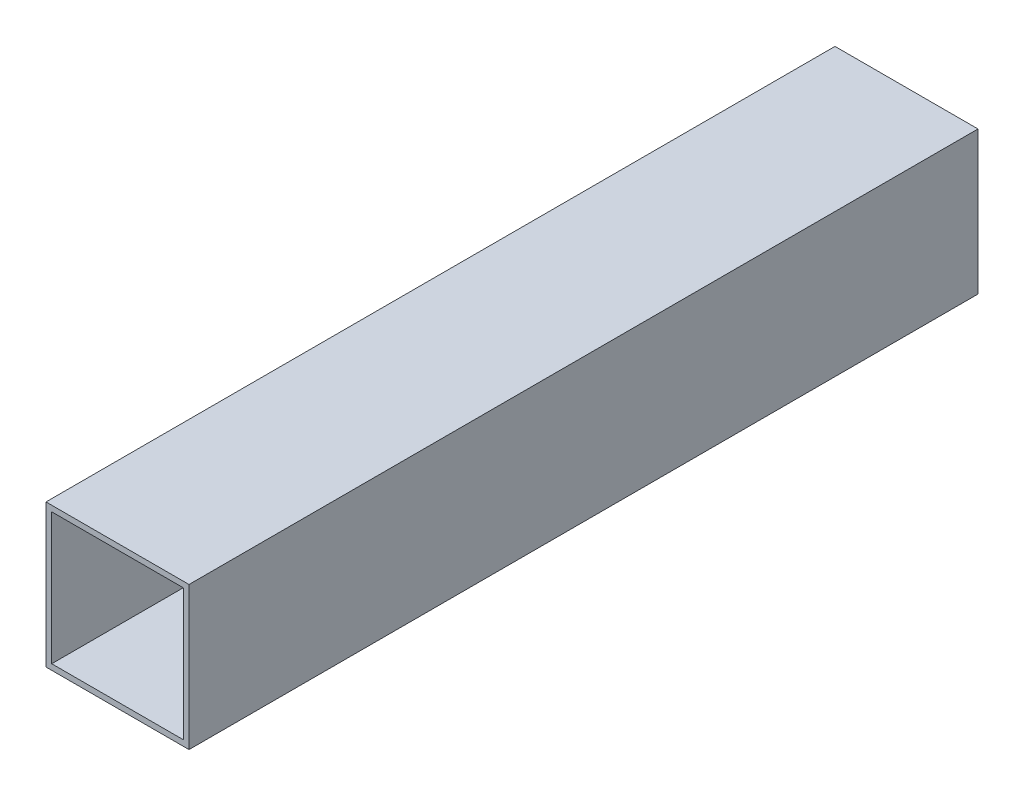
ISO-10303-21;
HEADER;
FILE_DESCRIPTION(('STEP AP214'),'2;1');
FILE_NAME('part.step','',(''),(''),'','','');
FILE_SCHEMA(('AUTOMOTIVE_DESIGN { 1 0 10303 214 1 1 1 1 }'));
ENDSEC;
DATA;
#1=APPLICATION_CONTEXT('core data for automotive mechanical design processes');
#2=APPLICATION_PROTOCOL_DEFINITION('international standard','automotive_design',2000,#1);
#3=PRODUCT_CONTEXT('',#1,'mechanical');
#4=PRODUCT('Part','Part','',(#3));
#5=PRODUCT_RELATED_PRODUCT_CATEGORY('part','',(#4));
#6=PRODUCT_DEFINITION_FORMATION('','',#4);
#7=PRODUCT_DEFINITION_CONTEXT('part definition',#1,'design');
#8=PRODUCT_DEFINITION('design','',#6,#7);
#9=PRODUCT_DEFINITION_SHAPE('','',#8);
#10=(LENGTH_UNIT() NAMED_UNIT(*) SI_UNIT(.MILLI.,.METRE.));
#11=(NAMED_UNIT(*) PLANE_ANGLE_UNIT() SI_UNIT($,.RADIAN.));
#12=(NAMED_UNIT(*) SI_UNIT($,.STERADIAN.) SOLID_ANGLE_UNIT());
#13=UNCERTAINTY_MEASURE_WITH_UNIT(LENGTH_MEASURE(1.E-05),#10,'distance_accuracy_value','');
#14=(GEOMETRIC_REPRESENTATION_CONTEXT(3) GLOBAL_UNCERTAINTY_ASSIGNED_CONTEXT((#13)) GLOBAL_UNIT_ASSIGNED_CONTEXT((#10,
#11,#12)) REPRESENTATION_CONTEXT('',''));
#15=CARTESIAN_POINT('',(0.,0.,0.));
#16=DIRECTION('',(0.,0.,1.));
#17=DIRECTION('',(1.,0.,0.));
#18=AXIS2_PLACEMENT_3D('',#15,#16,#17);
#19=CARTESIAN_POINT('',(0.,0.,275.86));
#20=DIRECTION('',(0.,0.,-1.));
#21=DIRECTION('',(-1.,0.,0.));
#22=AXIS2_PLACEMENT_3D('',#19,#20,#21);
#23=PLANE('',#22);
#24=DIRECTION('',(0.,1.,0.));
#25=VECTOR('',#24,1.);
#26=CARTESIAN_POINT('',(25.,-25.,275.86));
#27=LINE('',#26,#25);
#28=CARTESIAN_POINT('',(25.,-25.,275.86));
#29=VERTEX_POINT('',#28);
#30=CARTESIAN_POINT('',(25.,25.,275.86));
#31=VERTEX_POINT('',#30);
#32=EDGE_CURVE('E153',#29,#31,#27,.T.);
#33=ORIENTED_EDGE('',*,*,#32,.T.);
#34=DIRECTION('',(-1.,0.,0.));
#35=VECTOR('',#34,1.);
#36=CARTESIAN_POINT('',(-25.,25.,275.86));
#37=LINE('',#36,#35);
#38=CARTESIAN_POINT('',(-25.,25.,275.86));
#39=VERTEX_POINT('',#38);
#40=EDGE_CURVE('E157',#31,#39,#37,.T.);
#41=ORIENTED_EDGE('',*,*,#40,.T.);
#42=DIRECTION('',(0.,-1.,0.));
#43=VECTOR('',#42,1.);
#44=CARTESIAN_POINT('',(-25.,-25.,275.86));
#45=LINE('',#44,#43);
#46=CARTESIAN_POINT('',(-25.,-25.,275.86));
#47=VERTEX_POINT('',#46);
#48=EDGE_CURVE('E161',#39,#47,#45,.T.);
#49=ORIENTED_EDGE('',*,*,#48,.T.);
#50=DIRECTION('',(1.,0.,0.));
#51=VECTOR('',#50,1.);
#52=CARTESIAN_POINT('',(-25.,-25.,275.86));
#53=LINE('',#52,#51);
#54=EDGE_CURVE('E164',#47,#29,#53,.T.);
#55=ORIENTED_EDGE('',*,*,#54,.T.);
#56=EDGE_LOOP('',(#33,#41,#49,#55));
#57=FACE_BOUND('',#56,.T.);
#58=DIRECTION('',(0.,1.,0.));
#59=VECTOR('',#58,1.);
#60=CARTESIAN_POINT('',(23.,-23.,275.86));
#61=LINE('',#60,#59);
#62=CARTESIAN_POINT('',(23.,-23.,275.86));
#63=VERTEX_POINT('',#62);
#64=CARTESIAN_POINT('',(23.,23.,275.86));
#65=VERTEX_POINT('',#64);
#66=EDGE_CURVE('E105',#63,#65,#61,.T.);
#67=ORIENTED_EDGE('',*,*,#66,.F.);
#68=DIRECTION('',(1.,0.,0.));
#69=VECTOR('',#68,1.);
#70=CARTESIAN_POINT('',(-23.,-23.,275.86));
#71=LINE('',#70,#69);
#72=CARTESIAN_POINT('',(-23.,-23.,275.86));
#73=VERTEX_POINT('',#72);
#74=EDGE_CURVE('E131',#73,#63,#71,.T.);
#75=ORIENTED_EDGE('',*,*,#74,.F.);
#76=DIRECTION('',(0.,-1.,0.));
#77=VECTOR('',#76,1.);
#78=CARTESIAN_POINT('',(-23.,-23.,275.86));
#79=LINE('',#78,#77);
#80=CARTESIAN_POINT('',(-23.,23.,275.86));
#81=VERTEX_POINT('',#80);
#82=EDGE_CURVE('E127',#81,#73,#79,.T.);
#83=ORIENTED_EDGE('',*,*,#82,.F.);
#84=DIRECTION('',(-1.,0.,0.));
#85=VECTOR('',#84,1.);
#86=CARTESIAN_POINT('',(-23.,23.,275.86));
#87=LINE('',#86,#85);
#88=EDGE_CURVE('E114',#65,#81,#87,.T.);
#89=ORIENTED_EDGE('',*,*,#88,.F.);
#90=EDGE_LOOP('',(#67,#75,#83,#89));
#91=FACE_BOUND('',#90,.T.);
#92=ADVANCED_FACE('F39',(#57,#91),#23,.F.);
#93=CARTESIAN_POINT('',(0.,0.,0.));
#94=DIRECTION('',(0.,0.,-1.));
#95=DIRECTION('',(-1.,0.,0.));
#96=AXIS2_PLACEMENT_3D('',#93,#94,#95);
#97=PLANE('',#96);
#98=DIRECTION('',(0.,1.,0.));
#99=VECTOR('',#98,1.);
#100=CARTESIAN_POINT('',(25.,-25.,0.));
#101=LINE('',#100,#99);
#102=CARTESIAN_POINT('',(25.,-25.,0.));
#103=VERTEX_POINT('',#102);
#104=CARTESIAN_POINT('',(25.,25.,0.));
#105=VERTEX_POINT('',#104);
#106=EDGE_CURVE('E123',#103,#105,#101,.T.);
#107=ORIENTED_EDGE('',*,*,#106,.F.);
#108=DIRECTION('',(1.,0.,0.));
#109=VECTOR('',#108,1.);
#110=CARTESIAN_POINT('',(-25.,-25.,0.));
#111=LINE('',#110,#109);
#112=CARTESIAN_POINT('',(-25.,-25.,0.));
#113=VERTEX_POINT('',#112);
#114=EDGE_CURVE('E158',#113,#103,#111,.T.);
#115=ORIENTED_EDGE('',*,*,#114,.F.);
#116=DIRECTION('',(0.,-1.,0.));
#117=VECTOR('',#116,1.);
#118=CARTESIAN_POINT('',(-25.,-25.,0.));
#119=LINE('',#118,#117);
#120=CARTESIAN_POINT('',(-25.,25.,0.));
#121=VERTEX_POINT('',#120);
#122=EDGE_CURVE('E174',#121,#113,#119,.T.);
#123=ORIENTED_EDGE('',*,*,#122,.F.);
#124=DIRECTION('',(-1.,0.,0.));
#125=VECTOR('',#124,1.);
#126=CARTESIAN_POINT('',(-25.,25.,0.));
#127=LINE('',#126,#125);
#128=EDGE_CURVE('E171',#105,#121,#127,.T.);
#129=ORIENTED_EDGE('',*,*,#128,.F.);
#130=EDGE_LOOP('',(#107,#115,#123,#129));
#131=FACE_BOUND('',#130,.T.);
#132=DIRECTION('',(1.,0.,0.));
#133=VECTOR('',#132,1.);
#134=CARTESIAN_POINT('',(-23.,-23.,0.));
#135=LINE('',#134,#133);
#136=CARTESIAN_POINT('',(-23.,-23.,0.));
#137=VERTEX_POINT('',#136);
#138=CARTESIAN_POINT('',(23.,-23.,0.));
#139=VERTEX_POINT('',#138);
#140=EDGE_CURVE('E115',#137,#139,#135,.T.);
#141=ORIENTED_EDGE('',*,*,#140,.T.);
#142=DIRECTION('',(0.,1.,0.));
#143=VECTOR('',#142,1.);
#144=CARTESIAN_POINT('',(23.,-23.,0.));
#145=LINE('',#144,#143);
#146=CARTESIAN_POINT('',(23.,23.,0.));
#147=VERTEX_POINT('',#146);
#148=EDGE_CURVE('E63',#139,#147,#145,.T.);
#149=ORIENTED_EDGE('',*,*,#148,.T.);
#150=DIRECTION('',(-1.,0.,0.));
#151=VECTOR('',#150,1.);
#152=CARTESIAN_POINT('',(-23.,23.,0.));
#153=LINE('',#152,#151);
#154=CARTESIAN_POINT('',(-23.,23.,0.));
#155=VERTEX_POINT('',#154);
#156=EDGE_CURVE('E121',#147,#155,#153,.T.);
#157=ORIENTED_EDGE('',*,*,#156,.T.);
#158=DIRECTION('',(0.,-1.,0.));
#159=VECTOR('',#158,1.);
#160=CARTESIAN_POINT('',(-23.,-23.,0.));
#161=LINE('',#160,#159);
#162=EDGE_CURVE('E140',#155,#137,#161,.T.);
#163=ORIENTED_EDGE('',*,*,#162,.T.);
#164=EDGE_LOOP('',(#141,#149,#157,#163));
#165=FACE_BOUND('',#164,.T.);
#166=ADVANCED_FACE('F197',(#131,#165),#97,.T.);
#167=CARTESIAN_POINT('',(25.,-25.,275.86));
#168=DIRECTION('',(-1.,0.,0.));
#169=DIRECTION('',(0.,0.,1.));
#170=AXIS2_PLACEMENT_3D('',#167,#168,#169);
#171=PLANE('',#170);
#172=ORIENTED_EDGE('',*,*,#106,.T.);
#173=DIRECTION('',(0.,0.,-1.));
#174=VECTOR('',#173,1.);
#175=CARTESIAN_POINT('',(25.,25.,275.86));
#176=LINE('',#175,#174);
#177=EDGE_CURVE('E11',#31,#105,#176,.T.);
#178=ORIENTED_EDGE('',*,*,#177,.F.);
#179=ORIENTED_EDGE('',*,*,#32,.F.);
#180=DIRECTION('',(0.,0.,-1.));
#181=VECTOR('',#180,1.);
#182=CARTESIAN_POINT('',(25.,-25.,275.86));
#183=LINE('',#182,#181);
#184=EDGE_CURVE('E167',#29,#103,#183,.T.);
#185=ORIENTED_EDGE('',*,*,#184,.T.);
#186=EDGE_LOOP('',(#172,#178,#179,#185));
#187=FACE_BOUND('',#186,.T.);
#188=ADVANCED_FACE('F41',(#187),#171,.F.);
#189=CARTESIAN_POINT('',(-25.,25.,275.86));
#190=DIRECTION('',(0.,-1.,0.));
#191=DIRECTION('',(0.,0.,-1.));
#192=AXIS2_PLACEMENT_3D('',#189,#190,#191);
#193=PLANE('',#192);
#194=ORIENTED_EDGE('',*,*,#128,.T.);
#195=DIRECTION('',(0.,0.,-1.));
#196=VECTOR('',#195,1.);
#197=CARTESIAN_POINT('',(-25.,25.,275.86));
#198=LINE('',#197,#196);
#199=EDGE_CURVE('E48',#39,#121,#198,.T.);
#200=ORIENTED_EDGE('',*,*,#199,.F.);
#201=ORIENTED_EDGE('',*,*,#40,.F.);
#202=ORIENTED_EDGE('',*,*,#177,.T.);
#203=EDGE_LOOP('',(#194,#200,#201,#202));
#204=FACE_BOUND('',#203,.T.);
#205=ADVANCED_FACE('F207',(#204),#193,.F.);
#206=CARTESIAN_POINT('',(-25.,-25.,275.86));
#207=DIRECTION('',(1.,0.,0.));
#208=DIRECTION('',(0.,0.,-1.));
#209=AXIS2_PLACEMENT_3D('',#206,#207,#208);
#210=PLANE('',#209);
#211=ORIENTED_EDGE('',*,*,#122,.T.);
#212=DIRECTION('',(0.,0.,-1.));
#213=VECTOR('',#212,1.);
#214=CARTESIAN_POINT('',(-25.,-25.,275.86));
#215=LINE('',#214,#213);
#216=EDGE_CURVE('E182',#47,#113,#215,.T.);
#217=ORIENTED_EDGE('',*,*,#216,.F.);
#218=ORIENTED_EDGE('',*,*,#48,.F.);
#219=ORIENTED_EDGE('',*,*,#199,.T.);
#220=EDGE_LOOP('',(#211,#217,#218,#219));
#221=FACE_BOUND('',#220,.T.);
#222=ADVANCED_FACE('F191',(#221),#210,.F.);
#223=CARTESIAN_POINT('',(-25.,-25.,275.86));
#224=DIRECTION('',(0.,1.,0.));
#225=DIRECTION('',(0.,0.,1.));
#226=AXIS2_PLACEMENT_3D('',#223,#224,#225);
#227=PLANE('',#226);
#228=ORIENTED_EDGE('',*,*,#114,.T.);
#229=ORIENTED_EDGE('',*,*,#184,.F.);
#230=ORIENTED_EDGE('',*,*,#54,.F.);
#231=ORIENTED_EDGE('',*,*,#216,.T.);
#232=EDGE_LOOP('',(#228,#229,#230,#231));
#233=FACE_BOUND('',#232,.T.);
#234=ADVANCED_FACE('F201',(#233),#227,.F.);
#235=CARTESIAN_POINT('',(23.,-23.,275.86));
#236=DIRECTION('',(-1.,0.,0.));
#237=DIRECTION('',(0.,0.,1.));
#238=AXIS2_PLACEMENT_3D('',#235,#236,#237);
#239=PLANE('',#238);
#240=ORIENTED_EDGE('',*,*,#148,.F.);
#241=DIRECTION('',(0.,0.,-1.));
#242=VECTOR('',#241,1.);
#243=CARTESIAN_POINT('',(23.,-23.,275.86));
#244=LINE('',#243,#242);
#245=EDGE_CURVE('E109',#63,#139,#244,.T.);
#246=ORIENTED_EDGE('',*,*,#245,.F.);
#247=ORIENTED_EDGE('',*,*,#66,.T.);
#248=DIRECTION('',(0.,0.,-1.));
#249=VECTOR('',#248,1.);
#250=CARTESIAN_POINT('',(23.,23.,275.86));
#251=LINE('',#250,#249);
#252=EDGE_CURVE('E108',#65,#147,#251,.T.);
#253=ORIENTED_EDGE('',*,*,#252,.T.);
#254=EDGE_LOOP('',(#240,#246,#247,#253));
#255=FACE_BOUND('',#254,.T.);
#256=ADVANCED_FACE('F107',(#255),#239,.T.);
#257=CARTESIAN_POINT('',(-23.,23.,275.86));
#258=DIRECTION('',(0.,-1.,0.));
#259=DIRECTION('',(0.,0.,-1.));
#260=AXIS2_PLACEMENT_3D('',#257,#258,#259);
#261=PLANE('',#260);
#262=ORIENTED_EDGE('',*,*,#156,.F.);
#263=ORIENTED_EDGE('',*,*,#252,.F.);
#264=ORIENTED_EDGE('',*,*,#88,.T.);
#265=DIRECTION('',(0.,0.,-1.));
#266=VECTOR('',#265,1.);
#267=CARTESIAN_POINT('',(-23.,23.,275.86));
#268=LINE('',#267,#266);
#269=EDGE_CURVE('E124',#81,#155,#268,.T.);
#270=ORIENTED_EDGE('',*,*,#269,.T.);
#271=EDGE_LOOP('',(#262,#263,#264,#270));
#272=FACE_BOUND('',#271,.T.);
#273=ADVANCED_FACE('F118',(#272),#261,.T.);
#274=CARTESIAN_POINT('',(-23.,-23.,275.86));
#275=DIRECTION('',(1.,0.,0.));
#276=DIRECTION('',(0.,0.,-1.));
#277=AXIS2_PLACEMENT_3D('',#274,#275,#276);
#278=PLANE('',#277);
#279=ORIENTED_EDGE('',*,*,#162,.F.);
#280=ORIENTED_EDGE('',*,*,#269,.F.);
#281=ORIENTED_EDGE('',*,*,#82,.T.);
#282=DIRECTION('',(0.,0.,-1.));
#283=VECTOR('',#282,1.);
#284=CARTESIAN_POINT('',(-23.,-23.,275.86));
#285=LINE('',#284,#283);
#286=EDGE_CURVE('E55',#73,#137,#285,.T.);
#287=ORIENTED_EDGE('',*,*,#286,.T.);
#288=EDGE_LOOP('',(#279,#280,#281,#287));
#289=FACE_BOUND('',#288,.T.);
#290=ADVANCED_FACE('F230',(#289),#278,.T.);
#291=CARTESIAN_POINT('',(-23.,-23.,275.86));
#292=DIRECTION('',(0.,1.,0.));
#293=DIRECTION('',(0.,0.,1.));
#294=AXIS2_PLACEMENT_3D('',#291,#292,#293);
#295=PLANE('',#294);
#296=ORIENTED_EDGE('',*,*,#140,.F.);
#297=ORIENTED_EDGE('',*,*,#286,.F.);
#298=ORIENTED_EDGE('',*,*,#74,.T.);
#299=ORIENTED_EDGE('',*,*,#245,.T.);
#300=EDGE_LOOP('',(#296,#297,#298,#299));
#301=FACE_BOUND('',#300,.T.);
#302=ADVANCED_FACE('F234',(#301),#295,.T.);
#303=CLOSED_SHELL('',(#92,#166,#188,#205,#222,#234,#256,#273,#290,#302));
#304=MANIFOLD_SOLID_BREP('B2',#303);
#305=ADVANCED_BREP_SHAPE_REPRESENTATION('',(#18,#304),#14);
#306=SHAPE_DEFINITION_REPRESENTATION(#9,#305);
ENDSEC;
END-ISO-10303-21;
